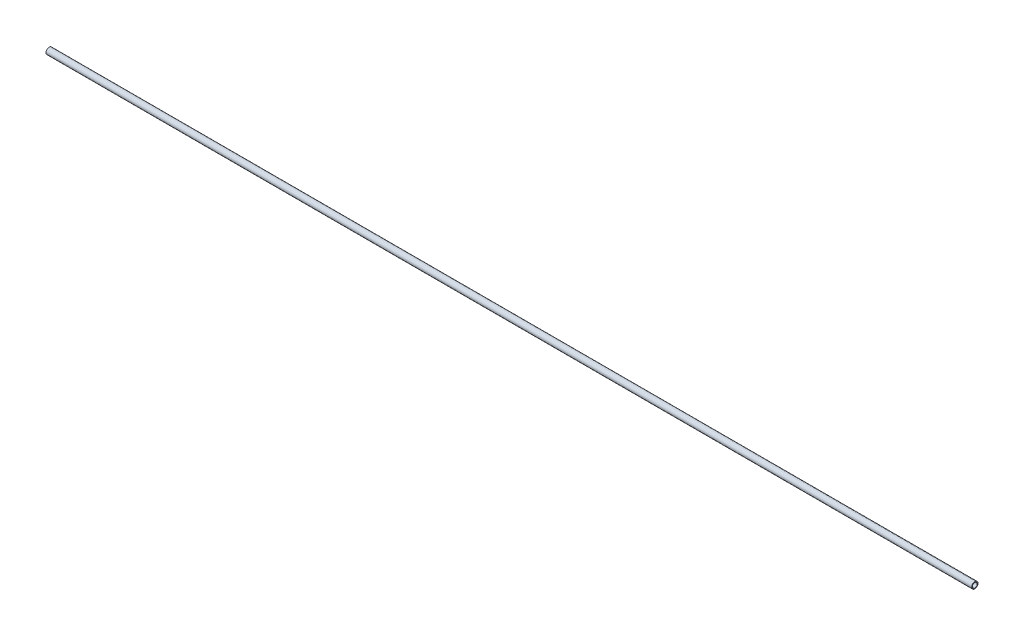
ISO-10303-21;
HEADER;
FILE_DESCRIPTION(('STEP AP214'),'2;1');
FILE_NAME('part.step','',(''),(''),'','','');
FILE_SCHEMA(('AUTOMOTIVE_DESIGN { 1 0 10303 214 1 1 1 1 }'));
ENDSEC;
DATA;
#1=APPLICATION_CONTEXT('core data for automotive mechanical design processes');
#2=APPLICATION_PROTOCOL_DEFINITION('international standard','automotive_design',2000,#1);
#3=PRODUCT_CONTEXT('',#1,'mechanical');
#4=PRODUCT('Part','Part','',(#3));
#5=PRODUCT_RELATED_PRODUCT_CATEGORY('part','',(#4));
#6=PRODUCT_DEFINITION_FORMATION('','',#4);
#7=PRODUCT_DEFINITION_CONTEXT('part definition',#1,'design');
#8=PRODUCT_DEFINITION('design','',#6,#7);
#9=PRODUCT_DEFINITION_SHAPE('','',#8);
#10=(LENGTH_UNIT() NAMED_UNIT(*) SI_UNIT(.MILLI.,.METRE.));
#11=(NAMED_UNIT(*) PLANE_ANGLE_UNIT() SI_UNIT($,.RADIAN.));
#12=(NAMED_UNIT(*) SI_UNIT($,.STERADIAN.) SOLID_ANGLE_UNIT());
#13=UNCERTAINTY_MEASURE_WITH_UNIT(LENGTH_MEASURE(1.E-05),#10,'distance_accuracy_value','');
#14=(GEOMETRIC_REPRESENTATION_CONTEXT(3) GLOBAL_UNCERTAINTY_ASSIGNED_CONTEXT((#13)) GLOBAL_UNIT_ASSIGNED_CONTEXT((#10,
#11,#12)) REPRESENTATION_CONTEXT('',''));
#15=CARTESIAN_POINT('',(0.,0.,0.));
#16=DIRECTION('',(0.,0.,1.));
#17=DIRECTION('',(1.,0.,0.));
#18=AXIS2_PLACEMENT_3D('',#15,#16,#17);
#19=CARTESIAN_POINT('',(3733.8,0.,0.));
#20=DIRECTION('',(1.,0.,0.));
#21=DIRECTION('',(0.,0.,-1.));
#22=AXIS2_PLACEMENT_3D('',#19,#20,#21);
#23=PLANE('',#22);
#24=CARTESIAN_POINT('',(3733.8,0.,0.));
#25=DIRECTION('',(1.,0.,0.));
#26=DIRECTION('',(0.,0.,-1.));
#27=AXIS2_PLACEMENT_3D('',#24,#25,#26);
#28=CIRCLE('',#27,12.7);
#29=CARTESIAN_POINT('',(3733.8,0.,-12.7));
#30=VERTEX_POINT('',#29);
#31=EDGE_CURVE('E10',#30,#30,#28,.T.);
#32=ORIENTED_EDGE('',*,*,#31,.T.);
#33=EDGE_LOOP('',(#32));
#34=FACE_BOUND('',#33,.T.);
#35=CARTESIAN_POINT('',(3733.8,0.,0.));
#36=DIRECTION('',(1.,0.,0.));
#37=DIRECTION('',(0.,0.,-1.));
#38=AXIS2_PLACEMENT_3D('',#35,#36,#37);
#39=CIRCLE('',#38,9.652);
#40=CARTESIAN_POINT('',(3733.8,0.,-9.652));
#41=VERTEX_POINT('',#40);
#42=EDGE_CURVE('E42',#41,#41,#39,.T.);
#43=ORIENTED_EDGE('',*,*,#42,.F.);
#44=EDGE_LOOP('',(#43));
#45=FACE_BOUND('',#44,.T.);
#46=ADVANCED_FACE('F31',(#34,#45),#23,.T.);
#47=CARTESIAN_POINT('',(0.,0.,0.));
#48=DIRECTION('',(1.,0.,0.));
#49=DIRECTION('',(0.,0.,-1.));
#50=AXIS2_PLACEMENT_3D('',#47,#48,#49);
#51=PLANE('',#50);
#52=CARTESIAN_POINT('',(0.,0.,0.));
#53=DIRECTION('',(1.,0.,0.));
#54=DIRECTION('',(0.,0.,-1.));
#55=AXIS2_PLACEMENT_3D('',#52,#53,#54);
#56=CIRCLE('',#55,12.7);
#57=CARTESIAN_POINT('',(0.,0.,-12.7));
#58=VERTEX_POINT('',#57);
#59=EDGE_CURVE('E35',#58,#58,#56,.T.);
#60=ORIENTED_EDGE('',*,*,#59,.F.);
#61=EDGE_LOOP('',(#60));
#62=FACE_BOUND('',#61,.T.);
#63=CARTESIAN_POINT('',(0.,0.,0.));
#64=DIRECTION('',(1.,0.,0.));
#65=DIRECTION('',(0.,0.,-1.));
#66=AXIS2_PLACEMENT_3D('',#63,#64,#65);
#67=CIRCLE('',#66,9.652);
#68=CARTESIAN_POINT('',(0.,0.,-9.652));
#69=VERTEX_POINT('',#68);
#70=EDGE_CURVE('E44',#69,#69,#67,.T.);
#71=ORIENTED_EDGE('',*,*,#70,.T.);
#72=EDGE_LOOP('',(#71));
#73=FACE_BOUND('',#72,.T.);
#74=ADVANCED_FACE('F54',(#62,#73),#51,.F.);
#75=CARTESIAN_POINT('',(3733.8,0.,0.));
#76=DIRECTION('',(-1.,0.,0.));
#77=DIRECTION('',(0.,0.,1.));
#78=AXIS2_PLACEMENT_3D('',#75,#76,#77);
#79=CYLINDRICAL_SURFACE('',#78,12.7);
#80=ORIENTED_EDGE('',*,*,#31,.F.);
#81=EDGE_LOOP('',(#80));
#82=FACE_BOUND('',#81,.T.);
#83=ORIENTED_EDGE('',*,*,#59,.T.);
#84=EDGE_LOOP('',(#83));
#85=FACE_BOUND('',#84,.T.);
#86=ADVANCED_FACE('F33',(#82,#85),#79,.T.);
#87=CARTESIAN_POINT('',(3733.8,0.,0.));
#88=DIRECTION('',(-1.,0.,0.));
#89=DIRECTION('',(0.,0.,1.));
#90=AXIS2_PLACEMENT_3D('',#87,#88,#89);
#91=CYLINDRICAL_SURFACE('',#90,9.652);
#92=ORIENTED_EDGE('',*,*,#42,.T.);
#93=EDGE_LOOP('',(#92));
#94=FACE_BOUND('',#93,.T.);
#95=ORIENTED_EDGE('',*,*,#70,.F.);
#96=EDGE_LOOP('',(#95));
#97=FACE_BOUND('',#96,.T.);
#98=ADVANCED_FACE('F50',(#94,#97),#91,.F.);
#99=CLOSED_SHELL('',(#46,#74,#86,#98));
#100=MANIFOLD_SOLID_BREP('B2',#99);
#101=ADVANCED_BREP_SHAPE_REPRESENTATION('',(#18,#100),#14);
#102=SHAPE_DEFINITION_REPRESENTATION(#9,#101);
ENDSEC;
END-ISO-10303-21;
